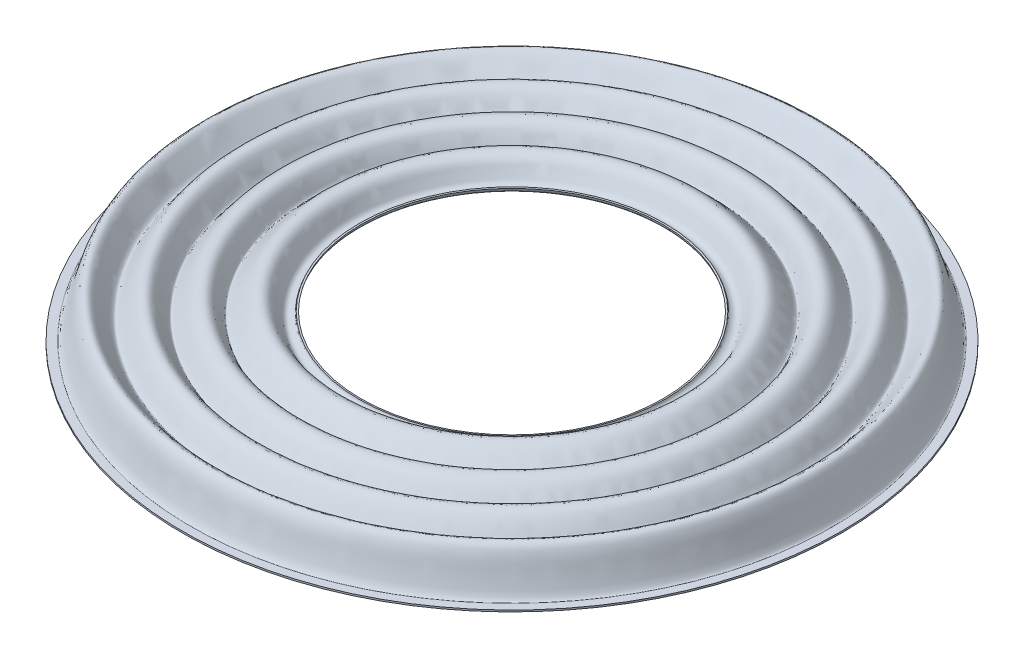
ISO-10303-21;
HEADER;
FILE_DESCRIPTION(('STEP AP214'),'2;1');
FILE_NAME('part.step','',(''),(''),'','','');
FILE_SCHEMA(('AUTOMOTIVE_DESIGN { 1 0 10303 214 1 1 1 1 }'));
ENDSEC;
DATA;
#1=APPLICATION_CONTEXT('core data for automotive mechanical design processes');
#2=APPLICATION_PROTOCOL_DEFINITION('international standard','automotive_design',2000,#1);
#3=PRODUCT_CONTEXT('',#1,'mechanical');
#4=PRODUCT('Part','Part','',(#3));
#5=PRODUCT_RELATED_PRODUCT_CATEGORY('part','',(#4));
#6=PRODUCT_DEFINITION_FORMATION('','',#4);
#7=PRODUCT_DEFINITION_CONTEXT('part definition',#1,'design');
#8=PRODUCT_DEFINITION('design','',#6,#7);
#9=PRODUCT_DEFINITION_SHAPE('','',#8);
#10=(LENGTH_UNIT() NAMED_UNIT(*) SI_UNIT(.MILLI.,.METRE.));
#11=(NAMED_UNIT(*) PLANE_ANGLE_UNIT() SI_UNIT($,.RADIAN.));
#12=(NAMED_UNIT(*) SI_UNIT($,.STERADIAN.) SOLID_ANGLE_UNIT());
#13=UNCERTAINTY_MEASURE_WITH_UNIT(LENGTH_MEASURE(1.E-05),#10,'distance_accuracy_value','');
#14=(GEOMETRIC_REPRESENTATION_CONTEXT(3) GLOBAL_UNCERTAINTY_ASSIGNED_CONTEXT((#13)) GLOBAL_UNIT_ASSIGNED_CONTEXT((#10,
#11,#12)) REPRESENTATION_CONTEXT('',''));
#15=CARTESIAN_POINT('',(0.,0.,0.));
#16=DIRECTION('',(0.,0.,1.));
#17=DIRECTION('',(1.,0.,0.));
#18=AXIS2_PLACEMENT_3D('',#15,#16,#17);
#19=CARTESIAN_POINT('',(-78.3701452199669,16.1451485859576,0.));
#20=CARTESIAN_POINT('',(-76.3867708448395,15.9945604602791,0.));
#21=CARTESIAN_POINT('',(-75.5534593051601,26.6128823081352,0.));
#22=CARTESIAN_POINT('',(-71.8985182576008,25.9284356290433,0.));
#23=CARTESIAN_POINT('',(-68.0930960661957,17.1896305499765,0.));
#24=CARTESIAN_POINT('',(-65.5964064155801,26.170277166583,0.));
#25=CARTESIAN_POINT('',(-61.2804778227581,26.2000567372494,0.));
#26=CARTESIAN_POINT('',(-58.8995318918434,17.4684657867459,0.));
#27=CARTESIAN_POINT('',(-56.1567854883686,26.1008950949019,0.));
#28=CARTESIAN_POINT('',(-50.8125839741515,26.2610745679555,0.));
#29=CARTESIAN_POINT('',(-50.130124381457,17.795669175048,0.));
#30=CARTESIAN_POINT('',(-45.5669149313924,26.331012949854,0.));
#31=CARTESIAN_POINT('',(-41.2685843445445,26.0357166005562,0.));
#32=CARTESIAN_POINT('',(-40.6632115174524,22.7359703486511,0.));
#33=CARTESIAN_POINT('',(-39.1600104804327,21.3130224790429,0.));
#34=CARTESIAN_POINT('',(-38.2659779921655,21.3454313966857,0.));
#35=CARTESIAN_POINT('',(-37.2657232483653,21.7917841316489,0.));
#36=CARTESIAN_POINT('',(-36.9015727760044,22.0390963282817,0.));
#37=CARTESIAN_POINT('',(-36.8200584154876,22.7497136348691,0.));
#38=B_SPLINE_CURVE_WITH_KNOTS('',3,(#19,#20,#21,#22,#23,#24,#25,#26,#27,#28,#29,#30,#31,#32,#33,
#34,#35,#36,#37),.UNSPECIFIED.,.F.,.F.,(4,1,1,1,1,1,1,1,1,1,1,1,1,1,1,1,4),(0.,
0.138276278763846,0.164776474790357,0.265001960265111,0.365227445739865,0.386920378684851,
0.481931289714971,0.57694220074509,0.597285442489629,0.68536370716036,0.773441971831093,
0.79345495262284,0.875267008138387,0.891961975301269,0.943709657088777,0.955160305580994,1.),.UNSPECIFIED.);
#39=CARTESIAN_POINT('',(0.,-9.3774464791081,0.));
#40=DIRECTION('',(0.,1.,0.));
#41=AXIS1_PLACEMENT('',#39,#40);
#42=SURFACE_OF_REVOLUTION('',#38,#41);
#43=CARTESIAN_POINT('',(0.,22.7497136348691,0.));
#44=DIRECTION('',(0.,1.,0.));
#45=DIRECTION('',(-1.,0.,0.));
#46=AXIS2_PLACEMENT_3D('',#43,#44,#45);
#47=CIRCLE('',#46,36.8200584154876);
#48=CARTESIAN_POINT('',(-36.8200584154875,22.7497136348691,0.));
#49=VERTEX_POINT('',#48);
#50=EDGE_CURVE('E55',#49,#49,#47,.T.);
#51=ORIENTED_EDGE('',*,*,#50,.T.);
#52=EDGE_LOOP('',(#51));
#53=FACE_BOUND('',#52,.T.);
#54=CARTESIAN_POINT('',(0.,16.1451485859576,0.));
#55=DIRECTION('',(0.,1.,0.));
#56=DIRECTION('',(-1.,0.,0.));
#57=AXIS2_PLACEMENT_3D('',#54,#55,#56);
#58=CIRCLE('',#57,78.3701452199668);
#59=CARTESIAN_POINT('',(-78.3701452199669,16.1451485859576,0.));
#60=VERTEX_POINT('',#59);
#61=EDGE_CURVE('E10',#60,#60,#58,.T.);
#62=ORIENTED_EDGE('',*,*,#61,.F.);
#63=EDGE_LOOP('',(#62));
#64=FACE_BOUND('',#63,.T.);
#65=ADVANCED_FACE('F32',(#53,#64),#42,.F.);
#66=CARTESIAN_POINT('',(-80.3701452199669,16.1451485859576,0.));
#67=DIRECTION('',(0.,-1.,0.));
#68=DIRECTION('',(1.,0.,0.));
#69=AXIS2_PLACEMENT_3D('',#66,#67,#68);
#70=PLANE('',#69);
#71=ORIENTED_EDGE('',*,*,#61,.T.);
#72=EDGE_LOOP('',(#71));
#73=FACE_BOUND('',#72,.T.);
#74=CARTESIAN_POINT('',(0.,16.1451485859576,0.));
#75=DIRECTION('',(0.,1.,0.));
#76=DIRECTION('',(-1.,0.,0.));
#77=AXIS2_PLACEMENT_3D('',#74,#75,#76);
#78=CIRCLE('',#77,80.3701452199668);
#79=CARTESIAN_POINT('',(-80.3701452199669,16.1451485859576,0.));
#80=VERTEX_POINT('',#79);
#81=EDGE_CURVE('E39',#80,#80,#78,.T.);
#82=ORIENTED_EDGE('',*,*,#81,.F.);
#83=EDGE_LOOP('',(#82));
#84=FACE_BOUND('',#83,.T.);
#85=ADVANCED_FACE('F80',(#73,#84),#70,.T.);
#86=CARTESIAN_POINT('',(0.,-9.3774464791081,0.));
#87=DIRECTION('',(0.,1.,0.));
#88=DIRECTION('',(-1.,0.,0.));
#89=AXIS2_PLACEMENT_3D('',#86,#87,#88);
#90=CYLINDRICAL_SURFACE('',#89,80.3701452199668);
#91=CARTESIAN_POINT('',(0.,16.5451485859576,0.));
#92=DIRECTION('',(0.,1.,0.));
#93=DIRECTION('',(-1.,0.,0.));
#94=AXIS2_PLACEMENT_3D('',#91,#92,#93);
#95=CIRCLE('',#94,80.3701452199668);
#96=CARTESIAN_POINT('',(-80.3701452199669,16.5451485859576,0.));
#97=VERTEX_POINT('',#96);
#98=EDGE_CURVE('E43',#97,#97,#95,.T.);
#99=ORIENTED_EDGE('',*,*,#98,.F.);
#100=EDGE_LOOP('',(#99));
#101=FACE_BOUND('',#100,.T.);
#102=ORIENTED_EDGE('',*,*,#81,.T.);
#103=EDGE_LOOP('',(#102));
#104=FACE_BOUND('',#103,.T.);
#105=ADVANCED_FACE('F77',(#101,#104),#90,.T.);
#106=CARTESIAN_POINT('',(-80.3701452199669,16.5451485859576,0.));
#107=DIRECTION('',(0.,-1.,0.));
#108=DIRECTION('',(1.,0.,0.));
#109=AXIS2_PLACEMENT_3D('',#106,#107,#108);
#110=PLANE('',#109);
#111=CARTESIAN_POINT('',(0.,16.5451485859576,0.));
#112=DIRECTION('',(0.,1.,0.));
#113=DIRECTION('',(-1.,0.,0.));
#114=AXIS2_PLACEMENT_3D('',#111,#112,#113);
#115=CIRCLE('',#114,78.3549819982042);
#116=CARTESIAN_POINT('',(-78.3549819982043,16.5451485859576,0.));
#117=VERTEX_POINT('',#116);
#118=EDGE_CURVE('E47',#117,#117,#115,.T.);
#119=ORIENTED_EDGE('',*,*,#118,.F.);
#120=EDGE_LOOP('',(#119));
#121=FACE_BOUND('',#120,.T.);
#122=ORIENTED_EDGE('',*,*,#98,.T.);
#123=EDGE_LOOP('',(#122));
#124=FACE_BOUND('',#123,.T.);
#125=ADVANCED_FACE('F73',(#121,#124),#110,.F.);
#126=CARTESIAN_POINT('',(-78.3549819982043,16.5451485859576,0.));
#127=CARTESIAN_POINT('',(-78.3479758449407,16.5446166422653,0.));
#128=CARTESIAN_POINT('',(-78.3402909899997,16.5440188382508,0.));
#129=CARTESIAN_POINT('',(-78.3347602827043,16.5436484957437,0.));
#130=CARTESIAN_POINT('',(-78.3265690693677,16.543232718754,0.));
#131=CARTESIAN_POINT('',(-78.3186337290435,16.5432135952196,0.));
#132=CARTESIAN_POINT('',(-78.3029404374367,16.5436727330887,0.));
#133=CARTESIAN_POINT('',(-78.2927107724531,16.5446319745923,0.));
#134=CARTESIAN_POINT('',(-78.2614435042885,16.5495913939409,0.));
#135=CARTESIAN_POINT('',(-78.2396613058479,16.5556247750976,0.));
#136=CARTESIAN_POINT('',(-78.1653386800377,16.5868786754064,0.));
#137=CARTESIAN_POINT('',(-78.1031128532403,16.6267538813166,0.));
#138=CARTESIAN_POINT('',(-77.8914268713987,16.8284712629556,0.));
#139=CARTESIAN_POINT('',(-77.7252104422142,17.0710811117681,0.));
#140=CARTESIAN_POINT('',(-77.4046529784677,17.7144693065826,0.));
#141=CARTESIAN_POINT('',(-77.247147397436,18.113404269475,0.));
#142=CARTESIAN_POINT('',(-76.9425269200697,19.0059751858378,0.));
#143=CARTESIAN_POINT('',(-76.7949080121761,19.4998523457526,0.));
#144=CARTESIAN_POINT('',(-76.359689234008,21.0458183398951,0.));
#145=CARTESIAN_POINT('',(-76.0800212977929,22.161413588987,0.));
#146=CARTESIAN_POINT('',(-75.6350873250453,23.6730495283128,0.));
#147=CARTESIAN_POINT('',(-75.4825422201195,24.1501167745969,0.));
#148=CARTESIAN_POINT('',(-75.1581378970252,25.0079333974118,0.));
#149=CARTESIAN_POINT('',(-74.987493399347,25.3883732027688,0.));
#150=CARTESIAN_POINT('',(-74.6957699662055,25.8629979693101,0.));
#151=CARTESIAN_POINT('',(-74.5923918807464,26.0055386644565,0.));
#152=CARTESIAN_POINT('',(-74.3607703713865,26.2542774407758,0.));
#153=CARTESIAN_POINT('',(-74.2298078607454,26.3620556281177,0.));
#154=CARTESIAN_POINT('',(-73.9349915016203,26.5153338512941,0.));
#155=CARTESIAN_POINT('',(-73.7731804031296,26.5588258401812,0.));
#156=CARTESIAN_POINT('',(-73.4517816984923,26.5739237318802,0.));
#157=CARTESIAN_POINT('',(-73.2939271826555,26.546802892971,0.));
#158=CARTESIAN_POINT('',(-72.8482817196347,26.3952827660877,0.));
#159=CARTESIAN_POINT('',(-72.5837804135532,26.205542326172,0.));
#160=CARTESIAN_POINT('',(-72.0750105087406,25.7337594492754,0.));
#161=CARTESIAN_POINT('',(-71.8292550251101,25.4481652694256,0.));
#162=CARTESIAN_POINT('',(-71.0935011876537,24.5091667112829,0.));
#163=CARTESIAN_POINT('',(-70.6053844458394,23.7713741919372,0.));
#164=CARTESIAN_POINT('',(-69.8925505209124,22.8010676238791,0.));
#165=CARTESIAN_POINT('',(-69.6584971608214,22.5007875004052,0.));
#166=CARTESIAN_POINT('',(-69.2108168183937,22.0031163867652,0.));
#167=CARTESIAN_POINT('',(-68.9957583949216,21.8068414889706,0.));
#168=CARTESIAN_POINT('',(-68.7205685633734,21.629568571985,0.));
#169=CARTESIAN_POINT('',(-68.6375393395536,21.5900800070153,0.));
#170=CARTESIAN_POINT('',(-68.4971363719193,21.5458550240744,0.));
#171=CARTESIAN_POINT('',(-68.4416853293266,21.5401973424966,0.));
#172=CARTESIAN_POINT('',(-68.3390458513843,21.5493538823355,0.));
#173=CARTESIAN_POINT('',(-68.2817558974588,21.5653359143418,0.));
#174=CARTESIAN_POINT('',(-68.1436331042475,21.6355211552749,0.));
#175=CARTESIAN_POINT('',(-68.0641864715551,21.6901328145928,0.));
#176=CARTESIAN_POINT('',(-67.8081069330245,21.9143607105753,0.));
#177=CARTESIAN_POINT('',(-67.6164590654276,22.1434029929678,0.));
#178=CARTESIAN_POINT('',(-67.2220814687007,22.6985309371478,0.));
#179=CARTESIAN_POINT('',(-67.0178416343934,23.023921772518,0.));
#180=CARTESIAN_POINT('',(-66.5948253845808,23.7098177496621,0.));
#181=CARTESIAN_POINT('',(-66.37583382583,24.0704096020391,0.));
#182=CARTESIAN_POINT('',(-65.9140826183124,24.7717859310995,0.));
#183=CARTESIAN_POINT('',(-65.6715458753741,25.1126958085002,0.));
#184=CARTESIAN_POINT('',(-65.1455087036213,25.7227115523892,0.));
#185=CARTESIAN_POINT('',(-64.8620696229786,25.9931268715707,0.));
#186=CARTESIAN_POINT('',(-64.3804025219538,26.2969335727124,0.));
#187=CARTESIAN_POINT('',(-64.2090090881569,26.3810666007529,0.));
#188=CARTESIAN_POINT('',(-63.85100858798,26.499634066234,0.));
#189=CARTESIAN_POINT('',(-63.6659415953519,26.5343591046119,0.));
#190=CARTESIAN_POINT('',(-63.2931204414003,26.5517459361225,0.));
#191=CARTESIAN_POINT('',(-63.1053920219615,26.534365999818,0.));
#192=CARTESIAN_POINT('',(-62.7379770374936,26.4462760697098,0.));
#193=CARTESIAN_POINT('',(-62.5576786651858,26.3741754169878,0.));
#194=CARTESIAN_POINT('',(-62.0552940963309,26.0936537139075,0.));
#195=CARTESIAN_POINT('',(-61.7649535181246,25.8269630333849,0.));
#196=CARTESIAN_POINT('',(-61.2325175489383,25.2166207344464,0.));
#197=CARTESIAN_POINT('',(-60.9902879532969,24.8709153922625,0.));
#198=CARTESIAN_POINT('',(-60.5340562852264,24.1579798024423,0.));
#199=CARTESIAN_POINT('',(-60.3203798830765,23.7905735628318,0.));
#200=CARTESIAN_POINT('',(-59.9133865428844,23.0970146944388,0.));
#201=CARTESIAN_POINT('',(-59.7197434890337,22.7706665774354,0.));
#202=CARTESIAN_POINT('',(-59.3542026524945,22.2299622861251,0.));
#203=CARTESIAN_POINT('',(-59.1789819504259,22.016581173207,0.));
#204=CARTESIAN_POINT('',(-58.9704175026765,21.8400193069059,0.));
#205=CARTESIAN_POINT('',(-58.9116775239578,21.8059766390191,0.));
#206=CARTESIAN_POINT('',(-58.8520330281947,21.7829563551448,0.));
#207=CARTESIAN_POINT('',(-58.836912959628,21.7795315295357,0.));
#208=CARTESIAN_POINT('',(-58.8129192762024,21.7765493602403,0.));
#209=CARTESIAN_POINT('',(-58.804202250408,21.7765933166696,0.));
#210=CARTESIAN_POINT('',(-58.7636832848865,21.7826221206489,0.));
#211=CARTESIAN_POINT('',(-58.7183606814429,21.7972178798017,0.));
#212=CARTESIAN_POINT('',(-58.592632801916,21.8758996484548,0.));
#213=CARTESIAN_POINT('',(-58.5146429392144,21.9390696417949,0.));
#214=CARTESIAN_POINT('',(-58.2583409245706,22.1938259651863,0.));
#215=CARTESIAN_POINT('',(-58.0593162481076,22.4484641268526,0.));
#216=CARTESIAN_POINT('',(-57.6317051136203,23.0486853831806,0.));
#217=CARTESIAN_POINT('',(-57.4013108783577,23.394361658742,0.));
#218=CARTESIAN_POINT('',(-56.9028076724152,24.1091906514089,0.));
#219=CARTESIAN_POINT('',(-56.6345748733614,24.478542044528,0.));
#220=CARTESIAN_POINT('',(-56.0472046807119,25.1782214638864,0.));
#221=CARTESIAN_POINT('',(-55.7281204173645,25.5090046738826,0.));
#222=CARTESIAN_POINT('',(-55.1950779757165,25.9266865814193,0.));
#223=CARTESIAN_POINT('',(-55.0082106514919,26.0527628571809,0.));
#224=CARTESIAN_POINT('',(-54.6133938640508,26.2681705290704,0.));
#225=CARTESIAN_POINT('',(-54.4045658217241,26.3576052363591,0.));
#226=CARTESIAN_POINT('',(-53.7513186859355,26.551237424162,0.));
#227=CARTESIAN_POINT('',(-53.2898271908862,26.5831384042663,0.));
#228=CARTESIAN_POINT('',(-52.6354595640159,26.4567652448522,0.));
#229=CARTESIAN_POINT('',(-52.4232623646968,26.3826732510231,0.));
#230=CARTESIAN_POINT('',(-52.0393790136392,26.1820488840347,0.));
#231=CARTESIAN_POINT('',(-51.8654052951711,26.0568029024567,0.));
#232=CARTESIAN_POINT('',(-51.3914888833675,25.6324060060542,0.));
#233=CARTESIAN_POINT('',(-51.1381045153537,25.2859417861771,0.));
#234=CARTESIAN_POINT('',(-50.6998335430261,24.5536085877936,0.));
#235=CARTESIAN_POINT('',(-50.5150272808318,24.1661976231894,0.));
#236=CARTESIAN_POINT('',(-50.1773855926288,23.4246267756346,0.));
#237=CARTESIAN_POINT('',(-50.0243339671327,23.0700233127518,0.));
#238=CARTESIAN_POINT('',(-49.8030922842839,22.6281756780143,0.));
#239=CARTESIAN_POINT('',(-49.7307871913884,22.4960562882423,0.));
#240=CARTESIAN_POINT('',(-49.5911727871715,22.2754233188349,0.));
#241=CARTESIAN_POINT('',(-49.5235571446942,22.1872920404149,0.));
#242=CARTESIAN_POINT('',(-49.4056011352974,22.0662446171446,0.));
#243=CARTESIAN_POINT('',(-49.3571449759608,22.0349803785922,0.));
#244=CARTESIAN_POINT('',(-49.3087955545882,22.0146103715365,0.));
#245=CARTESIAN_POINT('',(-49.2964124916778,22.0115314143625,0.));
#246=CARTESIAN_POINT('',(-49.2714702558043,22.0084538000797,0.));
#247=CARTESIAN_POINT('',(-49.2589358518862,22.0082266212526,0.));
#248=CARTESIAN_POINT('',(-49.1958958757688,22.0181017844994,0.));
#249=CARTESIAN_POINT('',(-49.1236330852862,22.0424315974238,0.));
#250=CARTESIAN_POINT('',(-48.9406583203265,22.1477382340555,0.));
#251=CARTESIAN_POINT('',(-48.8311497372458,22.2270109735093,0.));
#252=CARTESIAN_POINT('',(-48.4728974649793,22.5310793863306,0.));
#253=CARTESIAN_POINT('',(-48.1950326125006,22.8206510486856,0.));
#254=CARTESIAN_POINT('',(-47.599238251095,23.4826489432502,0.));
#255=CARTESIAN_POINT('',(-47.279918668741,23.85526281882,0.));
#256=CARTESIAN_POINT('',(-46.6111848930736,24.6023054990185,0.));
#257=CARTESIAN_POINT('',(-46.2618161214957,24.9768603018583,0.));
#258=CARTESIAN_POINT('',(-45.5361369470828,25.6509877752676,0.));
#259=CARTESIAN_POINT('',(-45.1603709146175,25.9514018089624,0.));
#260=CARTESIAN_POINT('',(-44.5650407170026,26.2844504331677,0.));
#261=CARTESIAN_POINT('',(-44.3609400825672,26.3757985100921,0.));
#262=CARTESIAN_POINT('',(-43.9387025013959,26.5030891005191,0.));
#263=CARTESIAN_POINT('',(-43.7269132776239,26.5366800852248,0.));
#264=CARTESIAN_POINT('',(-43.1078865289821,26.5594824037834,0.));
#265=CARTESIAN_POINT('',(-42.7174855937936,26.4715704390508,0.));
#266=CARTESIAN_POINT('',(-42.0440172752064,26.1588517412801,0.));
#267=CARTESIAN_POINT('',(-41.7599402284011,25.9344940175255,0.));
#268=CARTESIAN_POINT('',(-41.2783560711372,25.4200612322791,0.));
#269=CARTESIAN_POINT('',(-41.0790705779178,25.1297300746596,0.));
#270=CARTESIAN_POINT('',(-40.7294809609626,24.5290869411311,0.));
#271=CARTESIAN_POINT('',(-40.5791364435191,24.2182173145553,0.));
#272=CARTESIAN_POINT('',(-40.3015507330126,23.6165011699272,0.));
#273=CARTESIAN_POINT('',(-40.1742470570336,23.3254815212834,0.));
#274=CARTESIAN_POINT('',(-39.9248197746964,22.8088172113115,0.));
#275=CARTESIAN_POINT('',(-39.801781193148,22.5833782992285,0.));
#276=CARTESIAN_POINT('',(-39.5618931190355,22.2502150641516,0.));
#277=CARTESIAN_POINT('',(-39.4378881657517,22.1296804569706,0.));
#278=CARTESIAN_POINT('',(-39.1874582759834,21.9472071996298,0.));
#279=CARTESIAN_POINT('',(-39.0632758497261,21.8868572974259,0.));
#280=CARTESIAN_POINT('',(-38.8156016651432,21.8101567286933,0.));
#281=CARTESIAN_POINT('',(-38.6911128469097,21.7936147898059,0.));
#282=CARTESIAN_POINT('',(-38.4382623910758,21.7957922599505,0.));
#283=CARTESIAN_POINT('',(-38.3099830253924,21.8148680206024,0.));
#284=CARTESIAN_POINT('',(-38.0561221487908,21.8826490727255,0.));
#285=CARTESIAN_POINT('',(-37.9309284885804,21.9323399441033,0.));
#286=CARTESIAN_POINT('',(-37.7413626146529,22.0207669969841,0.));
#287=CARTESIAN_POINT('',(-37.6796971983014,22.0510749836274,0.));
#288=CARTESIAN_POINT('',(-37.5770228589479,22.1072966756677,0.));
#289=CARTESIAN_POINT('',(-37.5339408604344,22.1343491902724,0.));
#290=CARTESIAN_POINT('',(-37.4254030089936,22.2157614013577,0.));
#291=CARTESIAN_POINT('',(-37.3785407667561,22.2660969912851,0.));
#292=CARTESIAN_POINT('',(-37.2857192464292,22.4458554570349,0.));
#293=CARTESIAN_POINT('',(-37.2419316301219,22.5818964972213,0.));
#294=CARTESIAN_POINT('',(-37.2174524634526,22.7952983981346,0.));
#295=B_SPLINE_CURVE_WITH_KNOTS('',3,(#126,#127,#128,#129,#130,#131,#132,#133,#134,#135,#136,
#137,#138,#139,#140,#141,#142,#143,#144,#145,#146,#147,#148,#149,#150,#151,#152,#153,#154,#155,
#156,#157,#158,#159,#160,#161,#162,#163,#164,#165,#166,#167,#168,#169,#170,#171,#172,#173,#174,
#175,#176,#177,#178,#179,#180,#181,#182,#183,#184,#185,#186,#187,#188,#189,#190,#191,#192,#193,
#194,#195,#196,#197,#198,#199,#200,#201,#202,#203,#204,#205,#206,#207,#208,#209,#210,#211,#212,
#213,#214,#215,#216,#217,#218,#219,#220,#221,#222,#223,#224,#225,#226,#227,#228,#229,#230,#231,
#232,#233,#234,#235,#236,#237,#238,#239,#240,#241,#242,#243,#244,#245,#246,#247,#248,#249,#250,
#251,#252,#253,#254,#255,#256,#257,#258,#259,#260,#261,#262,#263,#264,#265,#266,#267,#268,#269,
#270,#271,#272,#273,#274,#275,#276,#277,#278,#279,#280,#281,#282,#283,#284,#285,#286,#287,#288,
#289,#290,#291,#292,#293,#294),.UNSPECIFIED.,.F.,.F.,(4,2,1,2,2,2,2,2,2,2,2,2,2,2,2,2,2,2,2,2,2,
2,2,2,2,2,2,2,2,2,2,2,2,2,2,2,2,2,2,2,2,2,2,2,2,2,2,2,2,2,2,2,2,2,2,2,2,2,2,2,2,2,2,2,2,2,2,2,2,
2,2,2,2,2,2,2,2,2,2,2,2,2,2,2,4),(0.,0.000488281250000965,0.000976562500001931,
0.00195312500000138,0.00390625000000029,0.00781250000000066,0.0156249999999997,
0.0312499999999979,0.046874999999996,0.0624999999999942,0.0937499999999904,0.109374999999989,
0.124999999999987,0.132812499999986,0.140624999999985,0.148437499999983,0.156249999999982,
0.171874999999981,0.187499999999979,0.218749999999976,0.234374999999975,0.249999999999974,
0.257812499999973,0.265624999999973,0.273437499999973,0.281249999999973,0.296874999999972,
0.312499999999972,0.328124999999971,0.343749999999971,0.35937499999997,0.36718749999997,
0.374999999999969,0.382812499999969,0.390624999999968,0.406249999999968,0.421874999999967,
0.437499999999966,0.453124999999965,0.468749999999965,0.476562499999965,0.480468749999965,
0.484374999999966,0.492187499999967,0.499999999999969,0.515624999999971,0.531249999999974,
0.546874999999977,0.56249999999998,0.570312499999981,0.578124999999982,0.593749999999985,
0.601562499999987,0.609374999999988,0.624999999999991,0.640624999999993,0.656249999999996,
0.664062499999997,0.671874999999998,0.6796875,0.68359375,0.6875,0.6953125,0.703124999999999,
0.718749999999999,0.734374999999999,0.749999999999999,0.765624999999999,0.773437499999999,
0.781249999999999,0.796874999999999,0.812499999999998,0.828124999999998,0.843749999999998,
0.859374999999998,0.874999999999998,0.890624999999997,0.906249999999997,0.921874999999997,
0.937499999999997,0.953124999999997,0.960937499999997,0.968749999999997,0.984374999999999,1.),.UNSPECIFIED.);
#296=CARTESIAN_POINT('',(0.,-9.3774464791081,0.));
#297=DIRECTION('',(0.,1.,0.));
#298=AXIS1_PLACEMENT('',#296,#297);
#299=SURFACE_OF_REVOLUTION('',#295,#298);
#300=CARTESIAN_POINT('',(0.,22.7952983981346,0.));
#301=DIRECTION('',(0.,1.,0.));
#302=DIRECTION('',(-1.,0.,0.));
#303=AXIS2_PLACEMENT_3D('',#300,#301,#302);
#304=CIRCLE('',#303,37.2174524634526);
#305=CARTESIAN_POINT('',(-37.2174524634526,22.7952983981346,0.));
#306=VERTEX_POINT('',#305);
#307=EDGE_CURVE('E52',#306,#306,#304,.T.);
#308=ORIENTED_EDGE('',*,*,#307,.F.);
#309=EDGE_LOOP('',(#308));
#310=FACE_BOUND('',#309,.T.);
#311=ORIENTED_EDGE('',*,*,#118,.T.);
#312=EDGE_LOOP('',(#311));
#313=FACE_BOUND('',#312,.T.);
#314=ADVANCED_FACE('F68',(#310,#313),#299,.T.);
#315=CARTESIAN_POINT('',(0.,22.7952983981346,0.));
#316=DIRECTION('',(0.,1.,0.));
#317=DIRECTION('',(-1.,0.,0.));
#318=AXIS2_PLACEMENT_3D('',#315,#316,#317);
#319=CONICAL_SURFACE('',#318,37.2174524634526,1.45658628917527);
#320=ORIENTED_EDGE('',*,*,#50,.F.);
#321=EDGE_LOOP('',(#320));
#322=FACE_BOUND('',#321,.T.);
#323=ORIENTED_EDGE('',*,*,#307,.T.);
#324=EDGE_LOOP('',(#323));
#325=FACE_BOUND('',#324,.T.);
#326=ADVANCED_FACE('F72',(#322,#325),#319,.F.);
#327=CLOSED_SHELL('',(#65,#85,#105,#125,#314,#326));
#328=MANIFOLD_SOLID_BREP('B2',#327);
#329=ADVANCED_BREP_SHAPE_REPRESENTATION('',(#18,#328),#14);
#330=SHAPE_DEFINITION_REPRESENTATION(#9,#329);
ENDSEC;
END-ISO-10303-21;
